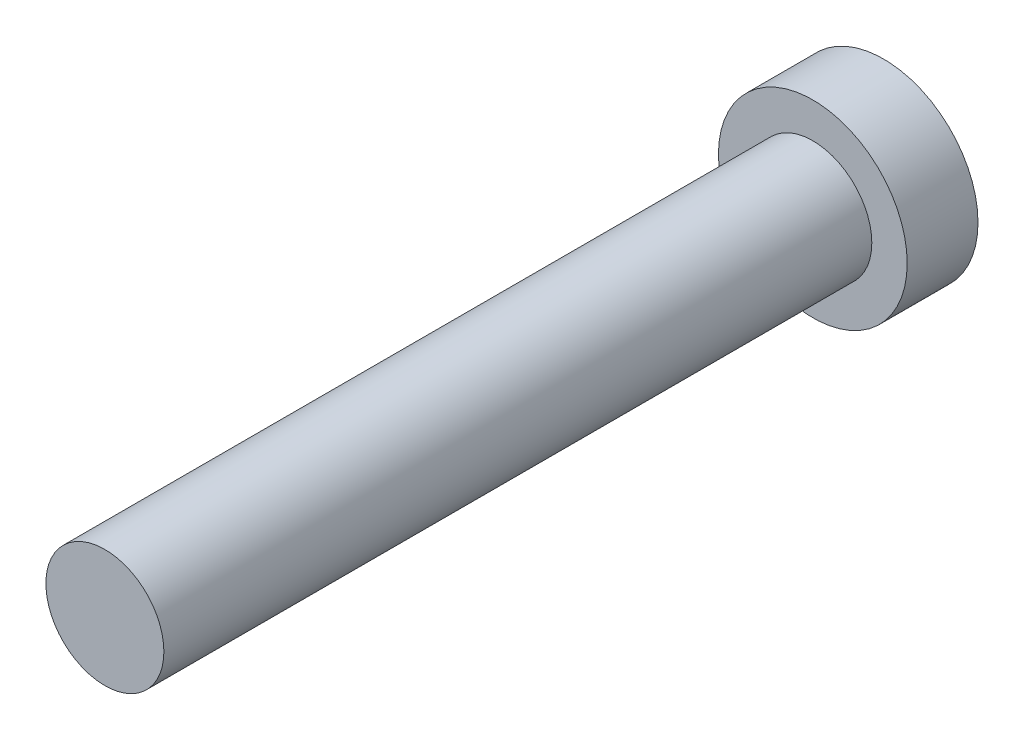
ISO-10303-21;
HEADER;
FILE_DESCRIPTION(('STEP AP214'),'2;1');
FILE_NAME('part.step','',(''),(''),'','','');
FILE_SCHEMA(('AUTOMOTIVE_DESIGN { 1 0 10303 214 1 1 1 1 }'));
ENDSEC;
DATA;
#1=APPLICATION_CONTEXT('core data for automotive mechanical design processes');
#2=APPLICATION_PROTOCOL_DEFINITION('international standard','automotive_design',2000,#1);
#3=PRODUCT_CONTEXT('',#1,'mechanical');
#4=PRODUCT('Part','Part','',(#3));
#5=PRODUCT_RELATED_PRODUCT_CATEGORY('part','',(#4));
#6=PRODUCT_DEFINITION_FORMATION('','',#4);
#7=PRODUCT_DEFINITION_CONTEXT('part definition',#1,'design');
#8=PRODUCT_DEFINITION('design','',#6,#7);
#9=PRODUCT_DEFINITION_SHAPE('','',#8);
#10=(LENGTH_UNIT() NAMED_UNIT(*) SI_UNIT(.MILLI.,.METRE.));
#11=(NAMED_UNIT(*) PLANE_ANGLE_UNIT() SI_UNIT($,.RADIAN.));
#12=(NAMED_UNIT(*) SI_UNIT($,.STERADIAN.) SOLID_ANGLE_UNIT());
#13=UNCERTAINTY_MEASURE_WITH_UNIT(LENGTH_MEASURE(1.E-05),#10,'distance_accuracy_value','');
#14=(GEOMETRIC_REPRESENTATION_CONTEXT(3) GLOBAL_UNCERTAINTY_ASSIGNED_CONTEXT((#13)) GLOBAL_UNIT_ASSIGNED_CONTEXT((#10,
#11,#12)) REPRESENTATION_CONTEXT('',''));
#15=CARTESIAN_POINT('',(0.,0.,0.));
#16=DIRECTION('',(0.,0.,1.));
#17=DIRECTION('',(1.,0.,0.));
#18=AXIS2_PLACEMENT_3D('',#15,#16,#17);
#19=CARTESIAN_POINT('',(0.,0.,3.));
#20=DIRECTION('',(0.,0.,-1.));
#21=DIRECTION('',(-1.,0.,0.));
#22=AXIS2_PLACEMENT_3D('',#19,#20,#21);
#23=CYLINDRICAL_SURFACE('',#22,4.);
#24=CARTESIAN_POINT('',(0.,0.,3.));
#25=DIRECTION('',(0.,0.,1.));
#26=DIRECTION('',(1.,0.,0.));
#27=AXIS2_PLACEMENT_3D('',#24,#25,#26);
#28=CIRCLE('',#27,4.);
#29=CARTESIAN_POINT('',(4.,0.,3.));
#30=VERTEX_POINT('',#29);
#31=EDGE_CURVE('E40',#30,#30,#28,.T.);
#32=ORIENTED_EDGE('',*,*,#31,.F.);
#33=EDGE_LOOP('',(#32));
#34=FACE_BOUND('',#33,.T.);
#35=CARTESIAN_POINT('',(0.,0.,0.));
#36=DIRECTION('',(0.,0.,1.));
#37=DIRECTION('',(1.,0.,0.));
#38=AXIS2_PLACEMENT_3D('',#35,#36,#37);
#39=CIRCLE('',#38,4.);
#40=CARTESIAN_POINT('',(4.,0.,0.));
#41=VERTEX_POINT('',#40);
#42=EDGE_CURVE('E36',#41,#41,#39,.T.);
#43=ORIENTED_EDGE('',*,*,#42,.T.);
#44=EDGE_LOOP('',(#43));
#45=FACE_BOUND('',#44,.T.);
#46=ADVANCED_FACE('F33',(#34,#45),#23,.T.);
#47=CARTESIAN_POINT('',(0.,0.,3.));
#48=DIRECTION('',(0.,0.,1.));
#49=DIRECTION('',(1.,0.,0.));
#50=AXIS2_PLACEMENT_3D('',#47,#48,#49);
#51=PLANE('',#50);
#52=CARTESIAN_POINT('',(0.,0.,3.));
#53=DIRECTION('',(0.,0.,1.));
#54=DIRECTION('',(1.,0.,0.));
#55=AXIS2_PLACEMENT_3D('',#52,#53,#54);
#56=CIRCLE('',#55,2.5);
#57=CARTESIAN_POINT('',(2.5,0.,3.));
#58=VERTEX_POINT('',#57);
#59=EDGE_CURVE('E10',#58,#58,#56,.T.);
#60=ORIENTED_EDGE('',*,*,#59,.F.);
#61=EDGE_LOOP('',(#60));
#62=FACE_BOUND('',#61,.T.);
#63=ORIENTED_EDGE('',*,*,#31,.T.);
#64=EDGE_LOOP('',(#63));
#65=FACE_BOUND('',#64,.T.);
#66=ADVANCED_FACE('F57',(#62,#65),#51,.T.);
#67=CARTESIAN_POINT('',(0.,0.,0.));
#68=DIRECTION('',(0.,0.,1.));
#69=DIRECTION('',(1.,0.,0.));
#70=AXIS2_PLACEMENT_3D('',#67,#68,#69);
#71=PLANE('',#70);
#72=ORIENTED_EDGE('',*,*,#42,.F.);
#73=EDGE_LOOP('',(#72));
#74=FACE_BOUND('',#73,.T.);
#75=ADVANCED_FACE('F54',(#74),#71,.F.);
#76=CARTESIAN_POINT('',(0.,0.,33.));
#77=DIRECTION('',(0.,0.,-1.));
#78=DIRECTION('',(-1.,0.,0.));
#79=AXIS2_PLACEMENT_3D('',#76,#77,#78);
#80=CYLINDRICAL_SURFACE('',#79,2.5);
#81=CARTESIAN_POINT('',(0.,0.,33.));
#82=DIRECTION('',(0.,0.,1.));
#83=DIRECTION('',(1.,0.,0.));
#84=AXIS2_PLACEMENT_3D('',#81,#82,#83);
#85=CIRCLE('',#84,2.5);
#86=CARTESIAN_POINT('',(2.5,0.,33.));
#87=VERTEX_POINT('',#86);
#88=EDGE_CURVE('E46',#87,#87,#85,.T.);
#89=ORIENTED_EDGE('',*,*,#88,.F.);
#90=EDGE_LOOP('',(#89));
#91=FACE_BOUND('',#90,.T.);
#92=ORIENTED_EDGE('',*,*,#59,.T.);
#93=EDGE_LOOP('',(#92));
#94=FACE_BOUND('',#93,.T.);
#95=ADVANCED_FACE('F56',(#91,#94),#80,.T.);
#96=CARTESIAN_POINT('',(0.,0.,33.));
#97=DIRECTION('',(0.,0.,1.));
#98=DIRECTION('',(1.,0.,0.));
#99=AXIS2_PLACEMENT_3D('',#96,#97,#98);
#100=PLANE('',#99);
#101=ORIENTED_EDGE('',*,*,#88,.T.);
#102=EDGE_LOOP('',(#101));
#103=FACE_BOUND('',#102,.T.);
#104=ADVANCED_FACE('F62',(#103),#100,.T.);
#105=CLOSED_SHELL('',(#46,#66,#75,#95,#104));
#106=MANIFOLD_SOLID_BREP('B2',#105);
#107=ADVANCED_BREP_SHAPE_REPRESENTATION('',(#18,#106),#14);
#108=SHAPE_DEFINITION_REPRESENTATION(#9,#107);
ENDSEC;
END-ISO-10303-21;
